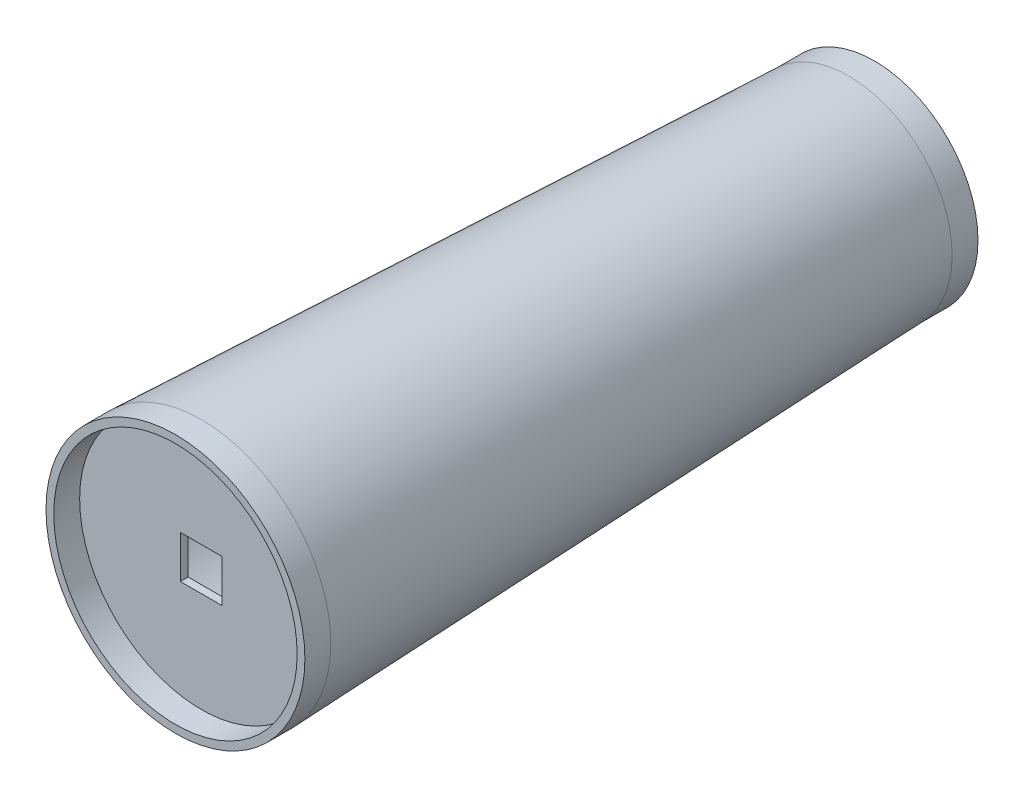
ISO-10303-21;
HEADER;
FILE_DESCRIPTION(('STEP AP214'),'2;1');
FILE_NAME('part.step','',(''),(''),'','','');
FILE_SCHEMA(('AUTOMOTIVE_DESIGN { 1 0 10303 214 1 1 1 1 }'));
ENDSEC;
DATA;
#1=APPLICATION_CONTEXT('core data for automotive mechanical design processes');
#2=APPLICATION_PROTOCOL_DEFINITION('international standard','automotive_design',2000,#1);
#3=PRODUCT_CONTEXT('',#1,'mechanical');
#4=PRODUCT('Part','Part','',(#3));
#5=PRODUCT_RELATED_PRODUCT_CATEGORY('part','',(#4));
#6=PRODUCT_DEFINITION_FORMATION('','',#4);
#7=PRODUCT_DEFINITION_CONTEXT('part definition',#1,'design');
#8=PRODUCT_DEFINITION('design','',#6,#7);
#9=PRODUCT_DEFINITION_SHAPE('','',#8);
#10=(LENGTH_UNIT() NAMED_UNIT(*) SI_UNIT(.MILLI.,.METRE.));
#11=(NAMED_UNIT(*) PLANE_ANGLE_UNIT() SI_UNIT($,.RADIAN.));
#12=(NAMED_UNIT(*) SI_UNIT($,.STERADIAN.) SOLID_ANGLE_UNIT());
#13=UNCERTAINTY_MEASURE_WITH_UNIT(LENGTH_MEASURE(1.E-05),#10,'distance_accuracy_value','');
#14=(GEOMETRIC_REPRESENTATION_CONTEXT(3) GLOBAL_UNCERTAINTY_ASSIGNED_CONTEXT((#13)) GLOBAL_UNIT_ASSIGNED_CONTEXT((#10,
#11,#12)) REPRESENTATION_CONTEXT('',''));
#15=CARTESIAN_POINT('',(0.,0.,0.));
#16=DIRECTION('',(0.,0.,1.));
#17=DIRECTION('',(1.,0.,0.));
#18=AXIS2_PLACEMENT_3D('',#15,#16,#17);
#19=CARTESIAN_POINT('',(0.,0.,-3.));
#20=DIRECTION('',(0.,0.,1.));
#21=DIRECTION('',(1.,0.,0.));
#22=AXIS2_PLACEMENT_3D('',#19,#20,#21);
#23=PLANE('',#22);
#24=DIRECTION('',(1.,0.,0.));
#25=VECTOR('',#24,1.);
#26=CARTESIAN_POINT('',(0.,-8.215,-3.));
#27=LINE('',#26,#25);
#28=CARTESIAN_POINT('',(-8.075,-8.215,-3.));
#29=VERTEX_POINT('',#28);
#30=CARTESIAN_POINT('',(8.075,-8.215,-3.));
#31=VERTEX_POINT('',#30);
#32=EDGE_CURVE('E132',#29,#31,#27,.T.);
#33=ORIENTED_EDGE('',*,*,#32,.T.);
#34=DIRECTION('',(0.,1.,0.));
#35=VECTOR('',#34,1.);
#36=CARTESIAN_POINT('',(8.075,0.,-3.));
#37=LINE('',#36,#35);
#38=CARTESIAN_POINT('',(8.075,8.215,-3.));
#39=VERTEX_POINT('',#38);
#40=EDGE_CURVE('E48',#31,#39,#37,.T.);
#41=ORIENTED_EDGE('',*,*,#40,.T.);
#42=DIRECTION('',(-1.,0.,0.));
#43=VECTOR('',#42,1.);
#44=CARTESIAN_POINT('',(0.,8.215,-3.));
#45=LINE('',#44,#43);
#46=CARTESIAN_POINT('',(-8.075,8.215,-3.));
#47=VERTEX_POINT('',#46);
#48=EDGE_CURVE('E86',#39,#47,#45,.T.);
#49=ORIENTED_EDGE('',*,*,#48,.T.);
#50=DIRECTION('',(0.,-1.,0.));
#51=VECTOR('',#50,1.);
#52=CARTESIAN_POINT('',(-8.075,0.,-3.));
#53=LINE('',#52,#51);
#54=EDGE_CURVE('E129',#47,#29,#53,.T.);
#55=ORIENTED_EDGE('',*,*,#54,.T.);
#56=EDGE_LOOP('',(#33,#41,#49,#55));
#57=FACE_BOUND('',#56,.T.);
#58=CARTESIAN_POINT('',(0.,0.,-3.));
#59=DIRECTION('',(0.,0.,1.));
#60=DIRECTION('',(1.,0.,0.));
#61=AXIS2_PLACEMENT_3D('',#58,#59,#60);
#62=CIRCLE('',#61,47.);
#63=CARTESIAN_POINT('',(47.,0.,-3.));
#64=VERTEX_POINT('',#63);
#65=EDGE_CURVE('E125',#64,#64,#62,.T.);
#66=ORIENTED_EDGE('',*,*,#65,.F.);
#67=EDGE_LOOP('',(#66));
#68=FACE_BOUND('',#67,.T.);
#69=ADVANCED_FACE('F40',(#57,#68),#23,.F.);
#70=CARTESIAN_POINT('',(0.,0.,-3.));
#71=DIRECTION('',(0.,0.,1.));
#72=DIRECTION('',(1.,0.,0.));
#73=AXIS2_PLACEMENT_3D('',#70,#71,#72);
#74=CONICAL_SURFACE('',#73,47.,0.03997868712329);
#75=CARTESIAN_POINT('',(0.,0.,-247.));
#76=DIRECTION('',(0.,0.,1.));
#77=DIRECTION('',(1.,0.,0.));
#78=AXIS2_PLACEMENT_3D('',#75,#76,#77);
#79=CIRCLE('',#78,37.24);
#80=CARTESIAN_POINT('',(37.24,0.,-247.));
#81=VERTEX_POINT('',#80);
#82=EDGE_CURVE('E122',#81,#81,#79,.T.);
#83=ORIENTED_EDGE('',*,*,#82,.F.);
#84=EDGE_LOOP('',(#83));
#85=FACE_BOUND('',#84,.T.);
#86=ORIENTED_EDGE('',*,*,#65,.T.);
#87=EDGE_LOOP('',(#86));
#88=FACE_BOUND('',#87,.T.);
#89=ADVANCED_FACE('F148',(#85,#88),#74,.F.);
#90=CARTESIAN_POINT('',(0.,37.24,-247.));
#91=DIRECTION('',(0.,0.,-1.));
#92=DIRECTION('',(-1.,0.,0.));
#93=AXIS2_PLACEMENT_3D('',#90,#91,#92);
#94=PLANE('',#93);
#95=ORIENTED_EDGE('',*,*,#82,.T.);
#96=EDGE_LOOP('',(#95));
#97=FACE_BOUND('',#96,.T.);
#98=ADVANCED_FACE('F152',(#97),#94,.F.);
#99=CARTESIAN_POINT('',(8.075,8.215,-10.));
#100=DIRECTION('',(1.,0.,0.));
#101=DIRECTION('',(0.,1.,0.));
#102=AXIS2_PLACEMENT_3D('',#99,#100,#101);
#103=PLANE('',#102);
#104=DIRECTION('',(0.,0.,1.));
#105=VECTOR('',#104,1.);
#106=CARTESIAN_POINT('',(8.075,-8.215,-10.));
#107=LINE('',#106,#105);
#108=CARTESIAN_POINT('',(8.075,-8.215,0.));
#109=VERTEX_POINT('',#108);
#110=EDGE_CURVE('E95',#31,#109,#107,.T.);
#111=ORIENTED_EDGE('',*,*,#110,.T.);
#112=DIRECTION('',(0.,1.,0.));
#113=VECTOR('',#112,1.);
#114=CARTESIAN_POINT('',(8.075,8.215,0.));
#115=LINE('',#114,#113);
#116=CARTESIAN_POINT('',(8.075,8.215,0.));
#117=VERTEX_POINT('',#116);
#118=EDGE_CURVE('E92',#109,#117,#115,.T.);
#119=ORIENTED_EDGE('',*,*,#118,.T.);
#120=DIRECTION('',(0.,0.,1.));
#121=VECTOR('',#120,1.);
#122=CARTESIAN_POINT('',(8.075,8.215,-10.));
#123=LINE('',#122,#121);
#124=EDGE_CURVE('E80',#39,#117,#123,.T.);
#125=ORIENTED_EDGE('',*,*,#124,.F.);
#126=ORIENTED_EDGE('',*,*,#40,.F.);
#127=EDGE_LOOP('',(#111,#119,#125,#126));
#128=FACE_BOUND('',#127,.T.);
#129=ADVANCED_FACE('F93',(#128),#103,.F.);
#130=CARTESIAN_POINT('',(-8.075,-8.215,-10.));
#131=DIRECTION('',(0.,-1.,0.));
#132=DIRECTION('',(0.,0.,-1.));
#133=AXIS2_PLACEMENT_3D('',#130,#131,#132);
#134=PLANE('',#133);
#135=DIRECTION('',(0.,0.,1.));
#136=VECTOR('',#135,1.);
#137=CARTESIAN_POINT('',(-8.075,-8.215,-10.));
#138=LINE('',#137,#136);
#139=CARTESIAN_POINT('',(-8.075,-8.215,0.));
#140=VERTEX_POINT('',#139);
#141=EDGE_CURVE('E108',#29,#140,#138,.T.);
#142=ORIENTED_EDGE('',*,*,#141,.T.);
#143=DIRECTION('',(1.,0.,0.));
#144=VECTOR('',#143,1.);
#145=CARTESIAN_POINT('',(-8.075,-8.215,0.));
#146=LINE('',#145,#144);
#147=EDGE_CURVE('E89',#140,#109,#146,.T.);
#148=ORIENTED_EDGE('',*,*,#147,.T.);
#149=ORIENTED_EDGE('',*,*,#110,.F.);
#150=ORIENTED_EDGE('',*,*,#32,.F.);
#151=EDGE_LOOP('',(#142,#148,#149,#150));
#152=FACE_BOUND('',#151,.T.);
#153=ADVANCED_FACE('F137',(#152),#134,.F.);
#154=CARTESIAN_POINT('',(-8.075,8.215,-10.));
#155=DIRECTION('',(-1.,0.,0.));
#156=DIRECTION('',(0.,-1.,0.));
#157=AXIS2_PLACEMENT_3D('',#154,#155,#156);
#158=PLANE('',#157);
#159=DIRECTION('',(0.,0.,1.));
#160=VECTOR('',#159,1.);
#161=CARTESIAN_POINT('',(-8.075,8.215,-10.));
#162=LINE('',#161,#160);
#163=CARTESIAN_POINT('',(-8.075,8.215,0.));
#164=VERTEX_POINT('',#163);
#165=EDGE_CURVE('E62',#47,#164,#162,.T.);
#166=ORIENTED_EDGE('',*,*,#165,.T.);
#167=DIRECTION('',(0.,-1.,0.));
#168=VECTOR('',#167,1.);
#169=CARTESIAN_POINT('',(-8.075,8.215,0.));
#170=LINE('',#169,#168);
#171=EDGE_CURVE('E55',#164,#140,#170,.T.);
#172=ORIENTED_EDGE('',*,*,#171,.T.);
#173=ORIENTED_EDGE('',*,*,#141,.F.);
#174=ORIENTED_EDGE('',*,*,#54,.F.);
#175=EDGE_LOOP('',(#166,#172,#173,#174));
#176=FACE_BOUND('',#175,.T.);
#177=ADVANCED_FACE('F138',(#176),#158,.F.);
#178=CARTESIAN_POINT('',(-8.075,8.215,-10.));
#179=DIRECTION('',(0.,1.,0.));
#180=DIRECTION('',(0.,0.,1.));
#181=AXIS2_PLACEMENT_3D('',#178,#179,#180);
#182=PLANE('',#181);
#183=ORIENTED_EDGE('',*,*,#124,.T.);
#184=DIRECTION('',(-1.,0.,0.));
#185=VECTOR('',#184,1.);
#186=CARTESIAN_POINT('',(-8.075,8.215,0.));
#187=LINE('',#186,#185);
#188=EDGE_CURVE('E84',#117,#164,#187,.T.);
#189=ORIENTED_EDGE('',*,*,#188,.T.);
#190=ORIENTED_EDGE('',*,*,#165,.F.);
#191=ORIENTED_EDGE('',*,*,#48,.F.);
#192=EDGE_LOOP('',(#183,#189,#190,#191));
#193=FACE_BOUND('',#192,.T.);
#194=ADVANCED_FACE('F82',(#193),#182,.F.);
#195=CARTESIAN_POINT('',(0.,50.,0.));
#196=DIRECTION('',(0.,0.,-1.));
#197=DIRECTION('',(-1.,0.,0.));
#198=AXIS2_PLACEMENT_3D('',#195,#196,#197);
#199=PLANE('',#198);
#200=CARTESIAN_POINT('',(0.,0.,0.));
#201=DIRECTION('',(0.,0.,1.));
#202=DIRECTION('',(1.,0.,0.));
#203=AXIS2_PLACEMENT_3D('',#200,#201,#202);
#204=CIRCLE('',#203,47.);
#205=CARTESIAN_POINT('',(47.,0.,0.));
#206=VERTEX_POINT('',#205);
#207=EDGE_CURVE('E107',#206,#206,#204,.T.);
#208=ORIENTED_EDGE('',*,*,#207,.T.);
#209=EDGE_LOOP('',(#208));
#210=FACE_BOUND('',#209,.T.);
#211=ORIENTED_EDGE('',*,*,#118,.F.);
#212=ORIENTED_EDGE('',*,*,#147,.F.);
#213=ORIENTED_EDGE('',*,*,#171,.F.);
#214=ORIENTED_EDGE('',*,*,#188,.F.);
#215=EDGE_LOOP('',(#211,#212,#213,#214));
#216=FACE_BOUND('',#215,.T.);
#217=ADVANCED_FACE('F42',(#210,#216),#199,.F.);
#218=CARTESIAN_POINT('',(0.,0.,-250.));
#219=DIRECTION('',(0.,0.,1.));
#220=DIRECTION('',(1.,0.,0.));
#221=AXIS2_PLACEMENT_3D('',#218,#219,#220);
#222=CONICAL_SURFACE('',#221,40.,0.0399786871232901);
#223=CARTESIAN_POINT('',(0.,0.,0.));
#224=DIRECTION('',(0.,0.,1.));
#225=DIRECTION('',(1.,0.,0.));
#226=AXIS2_PLACEMENT_3D('',#223,#224,#225);
#227=CIRCLE('',#226,50.);
#228=CARTESIAN_POINT('',(50.,0.,0.));
#229=VERTEX_POINT('',#228);
#230=EDGE_CURVE('E119',#229,#229,#227,.T.);
#231=ORIENTED_EDGE('',*,*,#230,.F.);
#232=EDGE_LOOP('',(#231));
#233=FACE_BOUND('',#232,.T.);
#234=CARTESIAN_POINT('',(0.,0.,-250.));
#235=DIRECTION('',(0.,0.,1.));
#236=DIRECTION('',(1.,0.,0.));
#237=AXIS2_PLACEMENT_3D('',#234,#235,#236);
#238=CIRCLE('',#237,40.);
#239=CARTESIAN_POINT('',(40.,0.,-250.));
#240=VERTEX_POINT('',#239);
#241=EDGE_CURVE('E252',#240,#240,#238,.T.);
#242=ORIENTED_EDGE('',*,*,#241,.T.);
#243=EDGE_LOOP('',(#242));
#244=FACE_BOUND('',#243,.T.);
#245=ADVANCED_FACE('F164',(#233,#244),#222,.T.);
#246=CARTESIAN_POINT('',(0.,0.,10.));
#247=DIRECTION('',(0.,0.,1.));
#248=DIRECTION('',(1.,0.,0.));
#249=AXIS2_PLACEMENT_3D('',#246,#247,#248);
#250=PLANE('',#249);
#251=CARTESIAN_POINT('',(0.,0.,10.));
#252=DIRECTION('',(0.,0.,1.));
#253=DIRECTION('',(1.,0.,0.));
#254=AXIS2_PLACEMENT_3D('',#251,#252,#253);
#255=CIRCLE('',#254,50.);
#256=CARTESIAN_POINT('',(50.,0.,10.));
#257=VERTEX_POINT('',#256);
#258=EDGE_CURVE('E114',#257,#257,#255,.T.);
#259=ORIENTED_EDGE('',*,*,#258,.T.);
#260=EDGE_LOOP('',(#259));
#261=FACE_BOUND('',#260,.T.);
#262=CARTESIAN_POINT('',(0.,0.,10.));
#263=DIRECTION('',(0.,0.,1.));
#264=DIRECTION('',(1.,0.,0.));
#265=AXIS2_PLACEMENT_3D('',#262,#263,#264);
#266=CIRCLE('',#265,47.);
#267=CARTESIAN_POINT('',(47.,0.,10.));
#268=VERTEX_POINT('',#267);
#269=EDGE_CURVE('E111',#268,#268,#266,.T.);
#270=ORIENTED_EDGE('',*,*,#269,.F.);
#271=EDGE_LOOP('',(#270));
#272=FACE_BOUND('',#271,.T.);
#273=ADVANCED_FACE('F167',(#261,#272),#250,.T.);
#274=CARTESIAN_POINT('',(0.,0.,10.));
#275=DIRECTION('',(0.,0.,-1.));
#276=DIRECTION('',(-1.,0.,0.));
#277=AXIS2_PLACEMENT_3D('',#274,#275,#276);
#278=CYLINDRICAL_SURFACE('',#277,50.);
#279=ORIENTED_EDGE('',*,*,#258,.F.);
#280=EDGE_LOOP('',(#279));
#281=FACE_BOUND('',#280,.T.);
#282=ORIENTED_EDGE('',*,*,#230,.T.);
#283=EDGE_LOOP('',(#282));
#284=FACE_BOUND('',#283,.T.);
#285=ADVANCED_FACE('F169',(#281,#284),#278,.T.);
#286=CARTESIAN_POINT('',(0.,0.,10.));
#287=DIRECTION('',(0.,0.,-1.));
#288=DIRECTION('',(-1.,0.,0.));
#289=AXIS2_PLACEMENT_3D('',#286,#287,#288);
#290=CYLINDRICAL_SURFACE('',#289,47.);
#291=ORIENTED_EDGE('',*,*,#269,.T.);
#292=EDGE_LOOP('',(#291));
#293=FACE_BOUND('',#292,.T.);
#294=ORIENTED_EDGE('',*,*,#207,.F.);
#295=EDGE_LOOP('',(#294));
#296=FACE_BOUND('',#295,.T.);
#297=ADVANCED_FACE('F172',(#293,#296),#290,.F.);
#298=CARTESIAN_POINT('',(0.,0.,-260.));
#299=DIRECTION('',(0.,0.,1.));
#300=DIRECTION('',(1.,0.,0.));
#301=AXIS2_PLACEMENT_3D('',#298,#299,#300);
#302=CYLINDRICAL_SURFACE('',#301,40.);
#303=CARTESIAN_POINT('',(0.,0.,-260.));
#304=DIRECTION('',(0.,0.,1.));
#305=DIRECTION('',(1.,0.,0.));
#306=AXIS2_PLACEMENT_3D('',#303,#304,#305);
#307=CIRCLE('',#306,40.);
#308=CARTESIAN_POINT('',(40.,0.,-260.));
#309=VERTEX_POINT('',#308);
#310=EDGE_CURVE('E99',#309,#309,#307,.T.);
#311=ORIENTED_EDGE('',*,*,#310,.T.);
#312=EDGE_LOOP('',(#311));
#313=FACE_BOUND('',#312,.T.);
#314=ORIENTED_EDGE('',*,*,#241,.F.);
#315=EDGE_LOOP('',(#314));
#316=FACE_BOUND('',#315,.T.);
#317=ADVANCED_FACE('F179',(#313,#316),#302,.T.);
#318=CARTESIAN_POINT('',(0.,0.,-260.));
#319=DIRECTION('',(0.,0.,1.));
#320=DIRECTION('',(1.,0.,0.));
#321=AXIS2_PLACEMENT_3D('',#318,#319,#320);
#322=PLANE('',#321);
#323=CARTESIAN_POINT('',(0.,0.,-260.));
#324=DIRECTION('',(0.,0.,1.));
#325=DIRECTION('',(1.,0.,0.));
#326=AXIS2_PLACEMENT_3D('',#323,#324,#325);
#327=CIRCLE('',#326,37.);
#328=CARTESIAN_POINT('',(37.,0.,-260.));
#329=VERTEX_POINT('',#328);
#330=EDGE_CURVE('E250',#329,#329,#327,.T.);
#331=ORIENTED_EDGE('',*,*,#330,.T.);
#332=EDGE_LOOP('',(#331));
#333=FACE_BOUND('',#332,.T.);
#334=ORIENTED_EDGE('',*,*,#310,.F.);
#335=EDGE_LOOP('',(#334));
#336=FACE_BOUND('',#335,.T.);
#337=ADVANCED_FACE('F219',(#333,#336),#322,.F.);
#338=CARTESIAN_POINT('',(0.,0.,-260.));
#339=DIRECTION('',(0.,0.,1.));
#340=DIRECTION('',(1.,0.,0.));
#341=AXIS2_PLACEMENT_3D('',#338,#339,#340);
#342=CYLINDRICAL_SURFACE('',#341,37.);
#343=ORIENTED_EDGE('',*,*,#330,.F.);
#344=EDGE_LOOP('',(#343));
#345=FACE_BOUND('',#344,.T.);
#346=CARTESIAN_POINT('',(0.,0.,-250.));
#347=DIRECTION('',(0.,0.,1.));
#348=DIRECTION('',(1.,0.,0.));
#349=AXIS2_PLACEMENT_3D('',#346,#347,#348);
#350=CIRCLE('',#349,37.);
#351=CARTESIAN_POINT('',(37.,0.,-250.));
#352=VERTEX_POINT('',#351);
#353=EDGE_CURVE('E11',#352,#352,#350,.T.);
#354=ORIENTED_EDGE('',*,*,#353,.T.);
#355=EDGE_LOOP('',(#354));
#356=FACE_BOUND('',#355,.T.);
#357=ADVANCED_FACE('F162',(#345,#356),#342,.F.);
#358=CARTESIAN_POINT('',(0.,0.,-250.));
#359=DIRECTION('',(0.,0.,1.));
#360=DIRECTION('',(1.,0.,0.));
#361=AXIS2_PLACEMENT_3D('',#358,#359,#360);
#362=PLANE('',#361);
#363=ORIENTED_EDGE('',*,*,#353,.F.);
#364=EDGE_LOOP('',(#363));
#365=FACE_BOUND('',#364,.T.);
#366=ADVANCED_FACE('F159',(#365),#362,.F.);
#367=CLOSED_SHELL('',(#69,#89,#98,#129,#153,#177,#194,#217,#245,#273,#285,#297,#317,#337,#357,#366));
#368=MANIFOLD_SOLID_BREP('B2',#367);
#369=ADVANCED_BREP_SHAPE_REPRESENTATION('',(#18,#368),#14);
#370=SHAPE_DEFINITION_REPRESENTATION(#9,#369);
ENDSEC;
END-ISO-10303-21;
